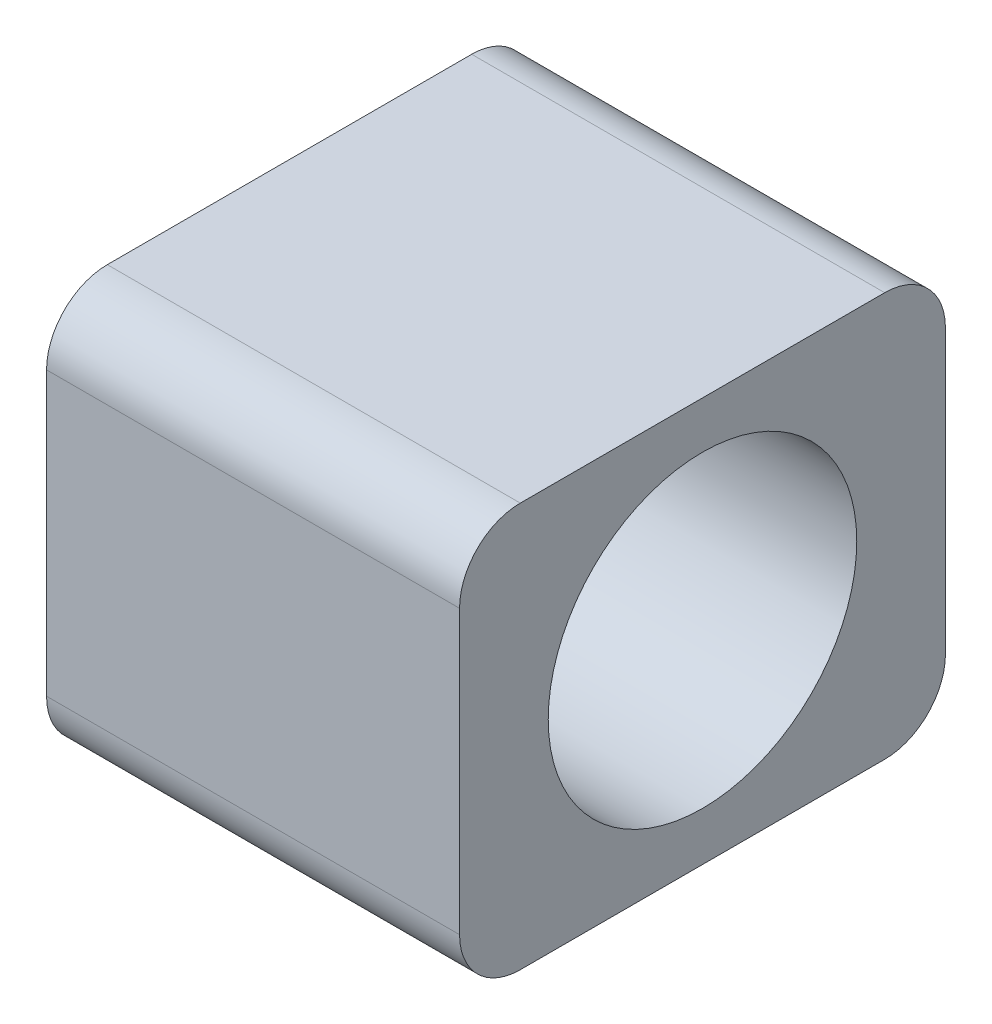
ISO-10303-21;
HEADER;
FILE_DESCRIPTION(('STEP AP214'),'2;1');
FILE_NAME('part.step','',(''),(''),'','','');
FILE_SCHEMA(('AUTOMOTIVE_DESIGN { 1 0 10303 214 1 1 1 1 }'));
ENDSEC;
DATA;
#1=APPLICATION_CONTEXT('core data for automotive mechanical design processes');
#2=APPLICATION_PROTOCOL_DEFINITION('international standard','automotive_design',2000,#1);
#3=PRODUCT_CONTEXT('',#1,'mechanical');
#4=PRODUCT('Part','Part','',(#3));
#5=PRODUCT_RELATED_PRODUCT_CATEGORY('part','',(#4));
#6=PRODUCT_DEFINITION_FORMATION('','',#4);
#7=PRODUCT_DEFINITION_CONTEXT('part definition',#1,'design');
#8=PRODUCT_DEFINITION('design','',#6,#7);
#9=PRODUCT_DEFINITION_SHAPE('','',#8);
#10=(LENGTH_UNIT() NAMED_UNIT(*) SI_UNIT(.MILLI.,.METRE.));
#11=(NAMED_UNIT(*) PLANE_ANGLE_UNIT() SI_UNIT($,.RADIAN.));
#12=(NAMED_UNIT(*) SI_UNIT($,.STERADIAN.) SOLID_ANGLE_UNIT());
#13=UNCERTAINTY_MEASURE_WITH_UNIT(LENGTH_MEASURE(1.E-05),#10,'distance_accuracy_value','');
#14=(GEOMETRIC_REPRESENTATION_CONTEXT(3) GLOBAL_UNCERTAINTY_ASSIGNED_CONTEXT((#13)) GLOBAL_UNIT_ASSIGNED_CONTEXT((#10,
#11,#12)) REPRESENTATION_CONTEXT('',''));
#15=CARTESIAN_POINT('',(0.,0.,0.));
#16=DIRECTION('',(0.,0.,1.));
#17=DIRECTION('',(1.,0.,0.));
#18=AXIS2_PLACEMENT_3D('',#15,#16,#17);
#19=CARTESIAN_POINT('',(17.,-11.7,15.));
#20=DIRECTION('',(1.,0.,0.));
#21=DIRECTION('',(0.,0.,-1.));
#22=AXIS2_PLACEMENT_3D('',#19,#20,#21);
#23=PLANE('',#22);
#24=CARTESIAN_POINT('',(17.,-11.7,15.));
#25=DIRECTION('',(1.,0.,0.));
#26=DIRECTION('',(0.,0.,-1.));
#27=AXIS2_PLACEMENT_3D('',#24,#25,#26);
#28=CIRCLE('',#27,5.);
#29=CARTESIAN_POINT('',(17.,-11.7,20.));
#30=VERTEX_POINT('',#29);
#31=CARTESIAN_POINT('',(17.,-16.7,15.));
#32=VERTEX_POINT('',#31);
#33=EDGE_CURVE('E151',#30,#32,#28,.T.);
#34=ORIENTED_EDGE('',*,*,#33,.T.);
#35=DIRECTION('',(0.,0.,-1.));
#36=VECTOR('',#35,1.);
#37=CARTESIAN_POINT('',(17.,-16.7,15.));
#38=LINE('',#37,#36);
#39=CARTESIAN_POINT('',(17.,-16.7,-15.));
#40=VERTEX_POINT('',#39);
#41=EDGE_CURVE('E99',#32,#40,#38,.T.);
#42=ORIENTED_EDGE('',*,*,#41,.T.);
#43=CARTESIAN_POINT('',(17.,-11.7,-15.));
#44=DIRECTION('',(1.,0.,0.));
#45=DIRECTION('',(0.,0.,-1.));
#46=AXIS2_PLACEMENT_3D('',#43,#44,#45);
#47=CIRCLE('',#46,5.);
#48=CARTESIAN_POINT('',(17.,-11.7,-20.));
#49=VERTEX_POINT('',#48);
#50=EDGE_CURVE('E166',#40,#49,#47,.T.);
#51=ORIENTED_EDGE('',*,*,#50,.T.);
#52=DIRECTION('',(0.,1.,0.));
#53=VECTOR('',#52,1.);
#54=CARTESIAN_POINT('',(17.,-11.7,-20.));
#55=LINE('',#54,#53);
#56=CARTESIAN_POINT('',(17.,11.569,-20.));
#57=VERTEX_POINT('',#56);
#58=EDGE_CURVE('E179',#49,#57,#55,.T.);
#59=ORIENTED_EDGE('',*,*,#58,.T.);
#60=CARTESIAN_POINT('',(17.,11.569,-15.));
#61=DIRECTION('',(1.,0.,0.));
#62=DIRECTION('',(0.,0.,-1.));
#63=AXIS2_PLACEMENT_3D('',#60,#61,#62);
#64=CIRCLE('',#63,5.);
#65=CARTESIAN_POINT('',(17.,16.569,-15.));
#66=VERTEX_POINT('',#65);
#67=EDGE_CURVE('E118',#57,#66,#64,.T.);
#68=ORIENTED_EDGE('',*,*,#67,.T.);
#69=DIRECTION('',(0.,0.,1.));
#70=VECTOR('',#69,1.);
#71=CARTESIAN_POINT('',(17.,16.569,-15.));
#72=LINE('',#71,#70);
#73=CARTESIAN_POINT('',(17.,16.569,15.));
#74=VERTEX_POINT('',#73);
#75=EDGE_CURVE('E112',#66,#74,#72,.T.);
#76=ORIENTED_EDGE('',*,*,#75,.T.);
#77=CARTESIAN_POINT('',(17.,11.569,15.));
#78=DIRECTION('',(1.,0.,0.));
#79=DIRECTION('',(0.,0.,-1.));
#80=AXIS2_PLACEMENT_3D('',#77,#78,#79);
#81=CIRCLE('',#80,5.);
#82=CARTESIAN_POINT('',(17.,11.569,20.));
#83=VERTEX_POINT('',#82);
#84=EDGE_CURVE('E116',#74,#83,#81,.T.);
#85=ORIENTED_EDGE('',*,*,#84,.T.);
#86=DIRECTION('',(0.,-1.,0.));
#87=VECTOR('',#86,1.);
#88=CARTESIAN_POINT('',(17.,11.569,20.));
#89=LINE('',#88,#87);
#90=EDGE_CURVE('E56',#83,#30,#89,.T.);
#91=ORIENTED_EDGE('',*,*,#90,.T.);
#92=EDGE_LOOP('',(#34,#42,#51,#59,#68,#76,#85,#91));
#93=FACE_BOUND('',#92,.T.);
#94=CARTESIAN_POINT('',(17.,0.,0.));
#95=DIRECTION('',(1.,0.,0.));
#96=DIRECTION('',(0.,0.,-1.));
#97=AXIS2_PLACEMENT_3D('',#94,#95,#96);
#98=CIRCLE('',#97,12.7);
#99=CARTESIAN_POINT('',(17.,0.,-12.7));
#100=VERTEX_POINT('',#99);
#101=EDGE_CURVE('E140',#100,#100,#98,.T.);
#102=ORIENTED_EDGE('',*,*,#101,.F.);
#103=EDGE_LOOP('',(#102));
#104=FACE_BOUND('',#103,.T.);
#105=ADVANCED_FACE('F39',(#93,#104),#23,.T.);
#106=CARTESIAN_POINT('',(-17.,-11.7,15.));
#107=DIRECTION('',(1.,0.,0.));
#108=DIRECTION('',(0.,0.,-1.));
#109=AXIS2_PLACEMENT_3D('',#106,#107,#108);
#110=PLANE('',#109);
#111=CARTESIAN_POINT('',(-17.,-11.7,15.));
#112=DIRECTION('',(1.,0.,0.));
#113=DIRECTION('',(0.,0.,-1.));
#114=AXIS2_PLACEMENT_3D('',#111,#112,#113);
#115=CIRCLE('',#114,5.);
#116=CARTESIAN_POINT('',(-17.,-11.7,20.));
#117=VERTEX_POINT('',#116);
#118=CARTESIAN_POINT('',(-17.,-16.7,15.));
#119=VERTEX_POINT('',#118);
#120=EDGE_CURVE('E136',#117,#119,#115,.T.);
#121=ORIENTED_EDGE('',*,*,#120,.F.);
#122=DIRECTION('',(0.,-1.,0.));
#123=VECTOR('',#122,1.);
#124=CARTESIAN_POINT('',(-17.,11.569,20.));
#125=LINE('',#124,#123);
#126=CARTESIAN_POINT('',(-17.,11.569,20.));
#127=VERTEX_POINT('',#126);
#128=EDGE_CURVE('E91',#127,#117,#125,.T.);
#129=ORIENTED_EDGE('',*,*,#128,.F.);
#130=CARTESIAN_POINT('',(-17.,11.569,15.));
#131=DIRECTION('',(1.,0.,0.));
#132=DIRECTION('',(0.,0.,-1.));
#133=AXIS2_PLACEMENT_3D('',#130,#131,#132);
#134=CIRCLE('',#133,5.);
#135=CARTESIAN_POINT('',(-17.,16.569,15.));
#136=VERTEX_POINT('',#135);
#137=EDGE_CURVE('E85',#136,#127,#134,.T.);
#138=ORIENTED_EDGE('',*,*,#137,.F.);
#139=DIRECTION('',(0.,0.,1.));
#140=VECTOR('',#139,1.);
#141=CARTESIAN_POINT('',(-17.,16.569,-15.));
#142=LINE('',#141,#140);
#143=CARTESIAN_POINT('',(-17.,16.569,-15.));
#144=VERTEX_POINT('',#143);
#145=EDGE_CURVE('E126',#144,#136,#142,.T.);
#146=ORIENTED_EDGE('',*,*,#145,.F.);
#147=CARTESIAN_POINT('',(-17.,11.569,-15.));
#148=DIRECTION('',(1.,0.,0.));
#149=DIRECTION('',(0.,0.,-1.));
#150=AXIS2_PLACEMENT_3D('',#147,#148,#149);
#151=CIRCLE('',#150,5.);
#152=CARTESIAN_POINT('',(-17.,11.569,-20.));
#153=VERTEX_POINT('',#152);
#154=EDGE_CURVE('E146',#153,#144,#151,.T.);
#155=ORIENTED_EDGE('',*,*,#154,.F.);
#156=DIRECTION('',(0.,1.,0.));
#157=VECTOR('',#156,1.);
#158=CARTESIAN_POINT('',(-17.,-11.7,-20.));
#159=LINE('',#158,#157);
#160=CARTESIAN_POINT('',(-17.,-11.7,-20.));
#161=VERTEX_POINT('',#160);
#162=EDGE_CURVE('E144',#161,#153,#159,.T.);
#163=ORIENTED_EDGE('',*,*,#162,.F.);
#164=CARTESIAN_POINT('',(-17.,-11.7,-15.));
#165=DIRECTION('',(1.,0.,0.));
#166=DIRECTION('',(0.,0.,-1.));
#167=AXIS2_PLACEMENT_3D('',#164,#165,#166);
#168=CIRCLE('',#167,5.);
#169=CARTESIAN_POINT('',(-17.,-16.7,-15.));
#170=VERTEX_POINT('',#169);
#171=EDGE_CURVE('E142',#170,#161,#168,.T.);
#172=ORIENTED_EDGE('',*,*,#171,.F.);
#173=DIRECTION('',(0.,0.,-1.));
#174=VECTOR('',#173,1.);
#175=CARTESIAN_POINT('',(-17.,-16.7,15.));
#176=LINE('',#175,#174);
#177=EDGE_CURVE('E139',#119,#170,#176,.T.);
#178=ORIENTED_EDGE('',*,*,#177,.F.);
#179=EDGE_LOOP('',(#121,#129,#138,#146,#155,#163,#172,#178));
#180=FACE_BOUND('',#179,.T.);
#181=CARTESIAN_POINT('',(-17.,0.,0.));
#182=DIRECTION('',(1.,0.,0.));
#183=DIRECTION('',(0.,0.,-1.));
#184=AXIS2_PLACEMENT_3D('',#181,#182,#183);
#185=CIRCLE('',#184,12.7);
#186=CARTESIAN_POINT('',(-17.,0.,-12.7));
#187=VERTEX_POINT('',#186);
#188=EDGE_CURVE('E185',#187,#187,#185,.T.);
#189=ORIENTED_EDGE('',*,*,#188,.T.);
#190=EDGE_LOOP('',(#189));
#191=FACE_BOUND('',#190,.T.);
#192=ADVANCED_FACE('F170',(#180,#191),#110,.F.);
#193=CARTESIAN_POINT('',(17.,-11.7,15.));
#194=DIRECTION('',(-1.,0.,0.));
#195=DIRECTION('',(0.,0.,1.));
#196=AXIS2_PLACEMENT_3D('',#193,#194,#195);
#197=CYLINDRICAL_SURFACE('',#196,5.);
#198=ORIENTED_EDGE('',*,*,#120,.T.);
#199=DIRECTION('',(-1.,0.,0.));
#200=VECTOR('',#199,1.);
#201=CARTESIAN_POINT('',(17.,-16.7,15.));
#202=LINE('',#201,#200);
#203=EDGE_CURVE('E11',#32,#119,#202,.T.);
#204=ORIENTED_EDGE('',*,*,#203,.F.);
#205=ORIENTED_EDGE('',*,*,#33,.F.);
#206=DIRECTION('',(-1.,0.,0.));
#207=VECTOR('',#206,1.);
#208=CARTESIAN_POINT('',(17.,-11.7,20.));
#209=LINE('',#208,#207);
#210=EDGE_CURVE('E132',#30,#117,#209,.T.);
#211=ORIENTED_EDGE('',*,*,#210,.T.);
#212=EDGE_LOOP('',(#198,#204,#205,#211));
#213=FACE_BOUND('',#212,.T.);
#214=ADVANCED_FACE('F41',(#213),#197,.T.);
#215=CARTESIAN_POINT('',(17.,-16.7,15.));
#216=DIRECTION('',(0.,1.,0.));
#217=DIRECTION('',(0.,0.,1.));
#218=AXIS2_PLACEMENT_3D('',#215,#216,#217);
#219=PLANE('',#218);
#220=ORIENTED_EDGE('',*,*,#177,.T.);
#221=DIRECTION('',(-1.,0.,0.));
#222=VECTOR('',#221,1.);
#223=CARTESIAN_POINT('',(17.,-16.7,-15.));
#224=LINE('',#223,#222);
#225=EDGE_CURVE('E48',#40,#170,#224,.T.);
#226=ORIENTED_EDGE('',*,*,#225,.F.);
#227=ORIENTED_EDGE('',*,*,#41,.F.);
#228=ORIENTED_EDGE('',*,*,#203,.T.);
#229=EDGE_LOOP('',(#220,#226,#227,#228));
#230=FACE_BOUND('',#229,.T.);
#231=ADVANCED_FACE('F213',(#230),#219,.F.);
#232=CARTESIAN_POINT('',(17.,-11.7,-15.));
#233=DIRECTION('',(-1.,0.,0.));
#234=DIRECTION('',(0.,0.,1.));
#235=AXIS2_PLACEMENT_3D('',#232,#233,#234);
#236=CYLINDRICAL_SURFACE('',#235,5.);
#237=ORIENTED_EDGE('',*,*,#171,.T.);
#238=DIRECTION('',(-1.,0.,0.));
#239=VECTOR('',#238,1.);
#240=CARTESIAN_POINT('',(17.,-11.7,-20.));
#241=LINE('',#240,#239);
#242=EDGE_CURVE('E158',#49,#161,#241,.T.);
#243=ORIENTED_EDGE('',*,*,#242,.F.);
#244=ORIENTED_EDGE('',*,*,#50,.F.);
#245=ORIENTED_EDGE('',*,*,#225,.T.);
#246=EDGE_LOOP('',(#237,#243,#244,#245));
#247=FACE_BOUND('',#246,.T.);
#248=ADVANCED_FACE('F164',(#247),#236,.T.);
#249=CARTESIAN_POINT('',(17.,-11.7,-20.));
#250=DIRECTION('',(0.,0.,1.));
#251=DIRECTION('',(1.,0.,0.));
#252=AXIS2_PLACEMENT_3D('',#249,#250,#251);
#253=PLANE('',#252);
#254=ORIENTED_EDGE('',*,*,#162,.T.);
#255=DIRECTION('',(-1.,0.,0.));
#256=VECTOR('',#255,1.);
#257=CARTESIAN_POINT('',(17.,11.569,-20.));
#258=LINE('',#257,#256);
#259=EDGE_CURVE('E155',#57,#153,#258,.T.);
#260=ORIENTED_EDGE('',*,*,#259,.F.);
#261=ORIENTED_EDGE('',*,*,#58,.F.);
#262=ORIENTED_EDGE('',*,*,#242,.T.);
#263=EDGE_LOOP('',(#254,#260,#261,#262));
#264=FACE_BOUND('',#263,.T.);
#265=ADVANCED_FACE('F175',(#264),#253,.F.);
#266=CARTESIAN_POINT('',(17.,11.569,-15.));
#267=DIRECTION('',(-1.,0.,0.));
#268=DIRECTION('',(0.,0.,1.));
#269=AXIS2_PLACEMENT_3D('',#266,#267,#268);
#270=CYLINDRICAL_SURFACE('',#269,5.);
#271=ORIENTED_EDGE('',*,*,#154,.T.);
#272=DIRECTION('',(-1.,0.,0.));
#273=VECTOR('',#272,1.);
#274=CARTESIAN_POINT('',(17.,16.569,-15.));
#275=LINE('',#274,#273);
#276=EDGE_CURVE('E127',#66,#144,#275,.T.);
#277=ORIENTED_EDGE('',*,*,#276,.F.);
#278=ORIENTED_EDGE('',*,*,#67,.F.);
#279=ORIENTED_EDGE('',*,*,#259,.T.);
#280=EDGE_LOOP('',(#271,#277,#278,#279));
#281=FACE_BOUND('',#280,.T.);
#282=ADVANCED_FACE('F178',(#281),#270,.T.);
#283=CARTESIAN_POINT('',(17.,16.569,-15.));
#284=DIRECTION('',(0.,-1.,0.));
#285=DIRECTION('',(0.,0.,-1.));
#286=AXIS2_PLACEMENT_3D('',#283,#284,#285);
#287=PLANE('',#286);
#288=ORIENTED_EDGE('',*,*,#145,.T.);
#289=DIRECTION('',(-1.,0.,0.));
#290=VECTOR('',#289,1.);
#291=CARTESIAN_POINT('',(17.,16.569,15.));
#292=LINE('',#291,#290);
#293=EDGE_CURVE('E123',#74,#136,#292,.T.);
#294=ORIENTED_EDGE('',*,*,#293,.F.);
#295=ORIENTED_EDGE('',*,*,#75,.F.);
#296=ORIENTED_EDGE('',*,*,#276,.T.);
#297=EDGE_LOOP('',(#288,#294,#295,#296));
#298=FACE_BOUND('',#297,.T.);
#299=ADVANCED_FACE('F124',(#298),#287,.F.);
#300=CARTESIAN_POINT('',(17.,11.569,15.));
#301=DIRECTION('',(-1.,0.,0.));
#302=DIRECTION('',(0.,0.,1.));
#303=AXIS2_PLACEMENT_3D('',#300,#301,#302);
#304=CYLINDRICAL_SURFACE('',#303,5.);
#305=ORIENTED_EDGE('',*,*,#137,.T.);
#306=DIRECTION('',(-1.,0.,0.));
#307=VECTOR('',#306,1.);
#308=CARTESIAN_POINT('',(17.,11.569,20.));
#309=LINE('',#308,#307);
#310=EDGE_CURVE('E128',#83,#127,#309,.T.);
#311=ORIENTED_EDGE('',*,*,#310,.F.);
#312=ORIENTED_EDGE('',*,*,#84,.F.);
#313=ORIENTED_EDGE('',*,*,#293,.T.);
#314=EDGE_LOOP('',(#305,#311,#312,#313));
#315=FACE_BOUND('',#314,.T.);
#316=ADVANCED_FACE('F130',(#315),#304,.T.);
#317=CARTESIAN_POINT('',(17.,11.569,20.));
#318=DIRECTION('',(0.,0.,-1.));
#319=DIRECTION('',(-1.,0.,0.));
#320=AXIS2_PLACEMENT_3D('',#317,#318,#319);
#321=PLANE('',#320);
#322=ORIENTED_EDGE('',*,*,#128,.T.);
#323=ORIENTED_EDGE('',*,*,#210,.F.);
#324=ORIENTED_EDGE('',*,*,#90,.F.);
#325=ORIENTED_EDGE('',*,*,#310,.T.);
#326=EDGE_LOOP('',(#322,#323,#324,#325));
#327=FACE_BOUND('',#326,.T.);
#328=ADVANCED_FACE('F201',(#327),#321,.F.);
#329=CARTESIAN_POINT('',(17.,0.,0.));
#330=DIRECTION('',(-1.,0.,0.));
#331=DIRECTION('',(0.,0.,1.));
#332=AXIS2_PLACEMENT_3D('',#329,#330,#331);
#333=CYLINDRICAL_SURFACE('',#332,12.7);
#334=ORIENTED_EDGE('',*,*,#101,.T.);
#335=EDGE_LOOP('',(#334));
#336=FACE_BOUND('',#335,.T.);
#337=ORIENTED_EDGE('',*,*,#188,.F.);
#338=EDGE_LOOP('',(#337));
#339=FACE_BOUND('',#338,.T.);
#340=ADVANCED_FACE('F191',(#336,#339),#333,.F.);
#341=CLOSED_SHELL('',(#105,#192,#214,#231,#248,#265,#282,#299,#316,#328,#340));
#342=MANIFOLD_SOLID_BREP('B2',#341);
#343=ADVANCED_BREP_SHAPE_REPRESENTATION('',(#18,#342),#14);
#344=SHAPE_DEFINITION_REPRESENTATION(#9,#343);
ENDSEC;
END-ISO-10303-21;
